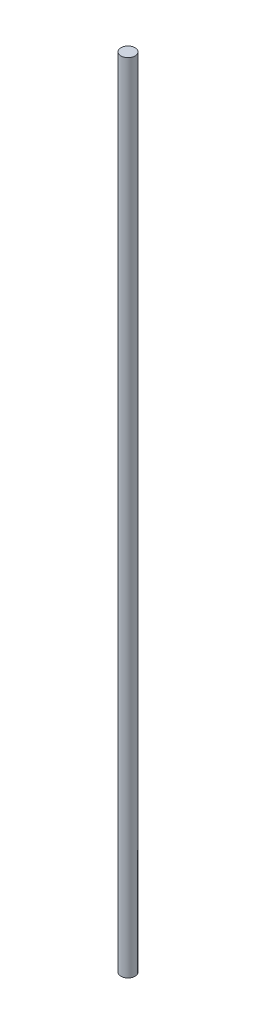
ISO-10303-21;
HEADER;
FILE_DESCRIPTION(('STEP AP214'),'2;1');
FILE_NAME('part.step','',(''),(''),'','','');
FILE_SCHEMA(('AUTOMOTIVE_DESIGN { 1 0 10303 214 1 1 1 1 }'));
ENDSEC;
DATA;
#1=APPLICATION_CONTEXT('core data for automotive mechanical design processes');
#2=APPLICATION_PROTOCOL_DEFINITION('international standard','automotive_design',2000,#1);
#3=PRODUCT_CONTEXT('',#1,'mechanical');
#4=PRODUCT('Part','Part','',(#3));
#5=PRODUCT_RELATED_PRODUCT_CATEGORY('part','',(#4));
#6=PRODUCT_DEFINITION_FORMATION('','',#4);
#7=PRODUCT_DEFINITION_CONTEXT('part definition',#1,'design');
#8=PRODUCT_DEFINITION('design','',#6,#7);
#9=PRODUCT_DEFINITION_SHAPE('','',#8);
#10=(LENGTH_UNIT() NAMED_UNIT(*) SI_UNIT(.MILLI.,.METRE.));
#11=(NAMED_UNIT(*) PLANE_ANGLE_UNIT() SI_UNIT($,.RADIAN.));
#12=(NAMED_UNIT(*) SI_UNIT($,.STERADIAN.) SOLID_ANGLE_UNIT());
#13=UNCERTAINTY_MEASURE_WITH_UNIT(LENGTH_MEASURE(1.E-05),#10,'distance_accuracy_value','');
#14=(GEOMETRIC_REPRESENTATION_CONTEXT(3) GLOBAL_UNCERTAINTY_ASSIGNED_CONTEXT((#13)) GLOBAL_UNIT_ASSIGNED_CONTEXT((#10,
#11,#12)) REPRESENTATION_CONTEXT('',''));
#15=CARTESIAN_POINT('',(0.,0.,0.));
#16=DIRECTION('',(0.,0.,1.));
#17=DIRECTION('',(1.,0.,0.));
#18=AXIS2_PLACEMENT_3D('',#15,#16,#17);
#19=CARTESIAN_POINT('',(0.,355.6,0.));
#20=DIRECTION('',(0.,-1.,0.));
#21=DIRECTION('',(0.,0.,-1.));
#22=AXIS2_PLACEMENT_3D('',#19,#20,#21);
#23=CYLINDRICAL_SURFACE('',#22,3.175);
#24=CARTESIAN_POINT('',(0.,355.6,0.));
#25=DIRECTION('',(0.,1.,0.));
#26=DIRECTION('',(0.,0.,1.));
#27=AXIS2_PLACEMENT_3D('',#24,#25,#26);
#28=CIRCLE('',#27,3.175);
#29=CARTESIAN_POINT('',(0.,355.6,3.175));
#30=VERTEX_POINT('',#29);
#31=EDGE_CURVE('E10',#30,#30,#28,.T.);
#32=ORIENTED_EDGE('',*,*,#31,.F.);
#33=EDGE_LOOP('',(#32));
#34=FACE_BOUND('',#33,.T.);
#35=CARTESIAN_POINT('',(0.,0.,0.));
#36=DIRECTION('',(0.,1.,0.));
#37=DIRECTION('',(0.,0.,1.));
#38=AXIS2_PLACEMENT_3D('',#35,#36,#37);
#39=CIRCLE('',#38,3.175);
#40=CARTESIAN_POINT('',(0.,0.,3.175));
#41=VERTEX_POINT('',#40);
#42=EDGE_CURVE('E46',#41,#41,#39,.T.);
#43=ORIENTED_EDGE('',*,*,#42,.T.);
#44=EDGE_LOOP('',(#43));
#45=FACE_BOUND('',#44,.T.);
#46=ADVANCED_FACE('F43',(#34,#45),#23,.T.);
#47=CARTESIAN_POINT('',(0.,355.6,0.));
#48=DIRECTION('',(0.,1.,0.));
#49=DIRECTION('',(0.,0.,1.));
#50=AXIS2_PLACEMENT_3D('',#47,#48,#49);
#51=PLANE('',#50);
#52=ORIENTED_EDGE('',*,*,#31,.T.);
#53=EDGE_LOOP('',(#52));
#54=FACE_BOUND('',#53,.T.);
#55=ADVANCED_FACE('F58',(#54),#51,.T.);
#56=CARTESIAN_POINT('',(0.,0.,0.));
#57=DIRECTION('',(0.,1.,0.));
#58=DIRECTION('',(0.,0.,1.));
#59=AXIS2_PLACEMENT_3D('',#56,#57,#58);
#60=PLANE('',#59);
#61=ORIENTED_EDGE('',*,*,#42,.F.);
#62=EDGE_LOOP('',(#61));
#63=FACE_BOUND('',#62,.T.);
#64=ADVANCED_FACE('F56',(#63),#60,.F.);
#65=CLOSED_SHELL('',(#46,#55,#64));
#66=MANIFOLD_SOLID_BREP('B2',#65);
#67=ADVANCED_BREP_SHAPE_REPRESENTATION('',(#18,#66),#14);
#68=SHAPE_DEFINITION_REPRESENTATION(#9,#67);
ENDSEC;
END-ISO-10303-21;
